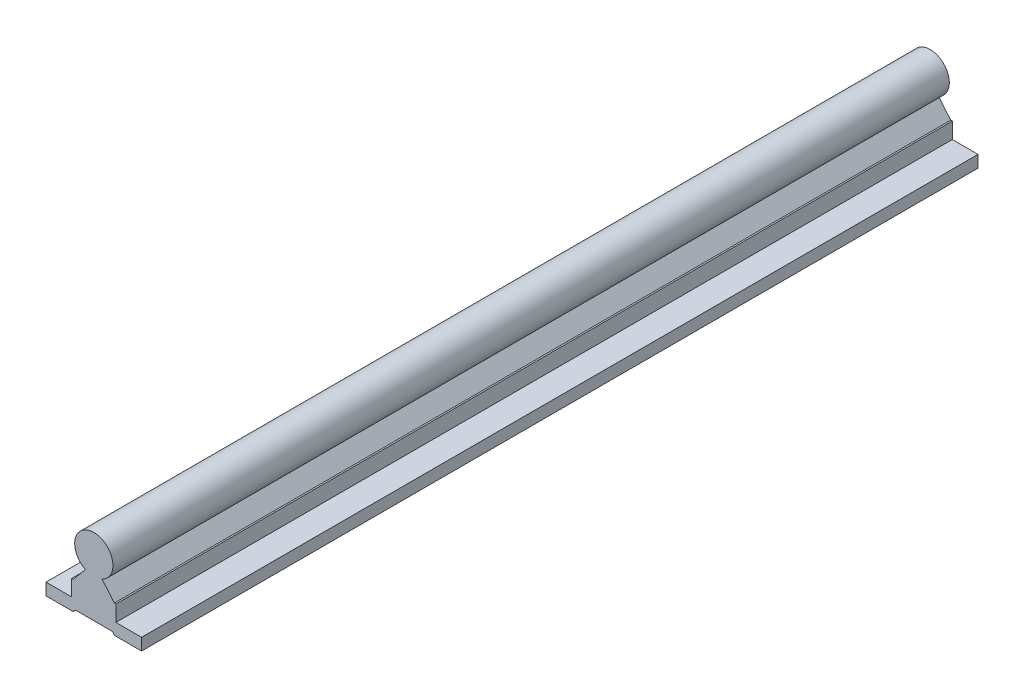
ISO-10303-21;
HEADER;
FILE_DESCRIPTION(('STEP AP214'),'2;1');
FILE_NAME('part.step','',(''),(''),'','','');
FILE_SCHEMA(('AUTOMOTIVE_DESIGN { 1 0 10303 214 1 1 1 1 }'));
ENDSEC;
DATA;
#1=APPLICATION_CONTEXT('core data for automotive mechanical design processes');
#2=APPLICATION_PROTOCOL_DEFINITION('international standard','automotive_design',2000,#1);
#3=PRODUCT_CONTEXT('',#1,'mechanical');
#4=PRODUCT('Part','Part','',(#3));
#5=PRODUCT_RELATED_PRODUCT_CATEGORY('part','',(#4));
#6=PRODUCT_DEFINITION_FORMATION('','',#4);
#7=PRODUCT_DEFINITION_CONTEXT('part definition',#1,'design');
#8=PRODUCT_DEFINITION('design','',#6,#7);
#9=PRODUCT_DEFINITION_SHAPE('','',#8);
#10=(LENGTH_UNIT() NAMED_UNIT(*) SI_UNIT(.MILLI.,.METRE.));
#11=(NAMED_UNIT(*) PLANE_ANGLE_UNIT() SI_UNIT($,.RADIAN.));
#12=(NAMED_UNIT(*) SI_UNIT($,.STERADIAN.) SOLID_ANGLE_UNIT());
#13=UNCERTAINTY_MEASURE_WITH_UNIT(LENGTH_MEASURE(1.E-05),#10,'distance_accuracy_value','');
#14=(GEOMETRIC_REPRESENTATION_CONTEXT(3) GLOBAL_UNCERTAINTY_ASSIGNED_CONTEXT((#13)) GLOBAL_UNIT_ASSIGNED_CONTEXT((#10,
#11,#12)) REPRESENTATION_CONTEXT('',''));
#15=CARTESIAN_POINT('',(0.,0.,0.));
#16=DIRECTION('',(0.,0.,1.));
#17=DIRECTION('',(1.,0.,0.));
#18=AXIS2_PLACEMENT_3D('',#15,#16,#17);
#19=CARTESIAN_POINT('',(0.,25.,350.));
#20=DIRECTION('',(0.,0.,-1.));
#21=DIRECTION('',(-1.,0.,0.));
#22=AXIS2_PLACEMENT_3D('',#19,#20,#21);
#23=CYLINDRICAL_SURFACE('',#22,8.);
#24=CARTESIAN_POINT('',(0.,25.,0.));
#25=DIRECTION('',(0.,0.,1.));
#26=DIRECTION('',(1.,0.,0.));
#27=AXIS2_PLACEMENT_3D('',#24,#25,#26);
#28=CIRCLE('',#27,8.);
#29=CARTESIAN_POINT('',(3.48711915483254,17.8,0.));
#30=VERTEX_POINT('',#29);
#31=CARTESIAN_POINT('',(-3.48711915483254,17.8,0.));
#32=VERTEX_POINT('',#31);
#33=EDGE_CURVE('E176',#30,#32,#28,.T.);
#34=ORIENTED_EDGE('',*,*,#33,.T.);
#35=DIRECTION('',(0.,0.,-1.));
#36=VECTOR('',#35,1.);
#37=CARTESIAN_POINT('',(-3.48711915483254,17.8,350.));
#38=LINE('',#37,#36);
#39=CARTESIAN_POINT('',(-3.48711915483254,17.8,350.));
#40=VERTEX_POINT('',#39);
#41=EDGE_CURVE('E11',#40,#32,#38,.T.);
#42=ORIENTED_EDGE('',*,*,#41,.F.);
#43=CARTESIAN_POINT('',(0.,25.,350.));
#44=DIRECTION('',(0.,0.,1.));
#45=DIRECTION('',(1.,0.,0.));
#46=AXIS2_PLACEMENT_3D('',#43,#44,#45);
#47=CIRCLE('',#46,8.);
#48=CARTESIAN_POINT('',(3.48711915483254,17.8,350.));
#49=VERTEX_POINT('',#48);
#50=EDGE_CURVE('E206',#49,#40,#47,.T.);
#51=ORIENTED_EDGE('',*,*,#50,.F.);
#52=DIRECTION('',(0.,0.,-1.));
#53=VECTOR('',#52,1.);
#54=CARTESIAN_POINT('',(3.48711915483254,17.8,350.));
#55=LINE('',#54,#53);
#56=EDGE_CURVE('E172',#49,#30,#55,.T.);
#57=ORIENTED_EDGE('',*,*,#56,.T.);
#58=EDGE_LOOP('',(#34,#42,#51,#57));
#59=FACE_BOUND('',#58,.T.);
#60=ADVANCED_FACE('F32',(#59),#23,.T.);
#61=CARTESIAN_POINT('',(-3.48711915483254,17.8,350.));
#62=DIRECTION('',(0.766044443118977,-0.64278760968654,0.));
#63=DIRECTION('',(0.64278760968654,0.766044443118977,0.));
#64=AXIS2_PLACEMENT_3D('',#61,#62,#63);
#65=PLANE('',#64);
#66=DIRECTION('',(-0.64278760968654,-0.766044443118977,0.));
#67=VECTOR('',#66,1.);
#68=CARTESIAN_POINT('',(-3.48711915483254,17.8,0.));
#69=LINE('',#68,#67);
#70=CARTESIAN_POINT('',(-8.60562690501396,11.7,0.));
#71=VERTEX_POINT('',#70);
#72=EDGE_CURVE('E179',#32,#71,#69,.T.);
#73=ORIENTED_EDGE('',*,*,#72,.T.);
#74=DIRECTION('',(0.,0.,-1.));
#75=VECTOR('',#74,1.);
#76=CARTESIAN_POINT('',(-8.60562690501396,11.7,350.));
#77=LINE('',#76,#75);
#78=CARTESIAN_POINT('',(-8.60562690501396,11.7,350.));
#79=VERTEX_POINT('',#78);
#80=EDGE_CURVE('E40',#79,#71,#77,.T.);
#81=ORIENTED_EDGE('',*,*,#80,.F.);
#82=DIRECTION('',(-0.64278760968654,-0.766044443118977,0.));
#83=VECTOR('',#82,1.);
#84=CARTESIAN_POINT('',(-3.48711915483254,17.8,350.));
#85=LINE('',#84,#83);
#86=EDGE_CURVE('E115',#40,#79,#85,.T.);
#87=ORIENTED_EDGE('',*,*,#86,.F.);
#88=ORIENTED_EDGE('',*,*,#41,.T.);
#89=EDGE_LOOP('',(#73,#81,#87,#88));
#90=FACE_BOUND('',#89,.T.);
#91=ADVANCED_FACE('F304',(#90),#65,.F.);
#92=CARTESIAN_POINT('',(-8.60562690501396,11.7,350.));
#93=DIRECTION('',(0.,-1.,0.));
#94=DIRECTION('',(0.,0.,-1.));
#95=AXIS2_PLACEMENT_3D('',#92,#93,#94);
#96=PLANE('',#95);
#97=DIRECTION('',(-1.,0.,0.));
#98=VECTOR('',#97,1.);
#99=CARTESIAN_POINT('',(-8.60562690501396,11.7,0.));
#100=LINE('',#99,#98);
#101=CARTESIAN_POINT('',(-9.25,11.7,0.));
#102=VERTEX_POINT('',#101);
#103=EDGE_CURVE('E181',#71,#102,#100,.T.);
#104=ORIENTED_EDGE('',*,*,#103,.T.);
#105=DIRECTION('',(0.,0.,-1.));
#106=VECTOR('',#105,1.);
#107=CARTESIAN_POINT('',(-9.25,11.7,350.));
#108=LINE('',#107,#106);
#109=CARTESIAN_POINT('',(-9.25,11.7,350.));
#110=VERTEX_POINT('',#109);
#111=EDGE_CURVE('E237',#110,#102,#108,.T.);
#112=ORIENTED_EDGE('',*,*,#111,.F.);
#113=DIRECTION('',(-1.,0.,0.));
#114=VECTOR('',#113,1.);
#115=CARTESIAN_POINT('',(-8.60562690501396,11.7,350.));
#116=LINE('',#115,#114);
#117=EDGE_CURVE('E245',#79,#110,#116,.T.);
#118=ORIENTED_EDGE('',*,*,#117,.F.);
#119=ORIENTED_EDGE('',*,*,#80,.T.);
#120=EDGE_LOOP('',(#104,#112,#118,#119));
#121=FACE_BOUND('',#120,.T.);
#122=ADVANCED_FACE('F243',(#121),#96,.F.);
#123=CARTESIAN_POINT('',(-9.25,11.7,350.));
#124=DIRECTION('',(1.,0.,0.));
#125=DIRECTION('',(0.,0.,-1.));
#126=AXIS2_PLACEMENT_3D('',#123,#124,#125);
#127=PLANE('',#126);
#128=DIRECTION('',(0.,-1.,0.));
#129=VECTOR('',#128,1.);
#130=CARTESIAN_POINT('',(-9.25,11.7,0.));
#131=LINE('',#130,#129);
#132=CARTESIAN_POINT('',(-9.25,5.,0.));
#133=VERTEX_POINT('',#132);
#134=EDGE_CURVE('E183',#102,#133,#131,.T.);
#135=ORIENTED_EDGE('',*,*,#134,.T.);
#136=DIRECTION('',(0.,0.,-1.));
#137=VECTOR('',#136,1.);
#138=CARTESIAN_POINT('',(-9.25,5.,350.));
#139=LINE('',#138,#137);
#140=CARTESIAN_POINT('',(-9.25,5.,350.));
#141=VERTEX_POINT('',#140);
#142=EDGE_CURVE('E234',#141,#133,#139,.T.);
#143=ORIENTED_EDGE('',*,*,#142,.F.);
#144=DIRECTION('',(0.,-1.,0.));
#145=VECTOR('',#144,1.);
#146=CARTESIAN_POINT('',(-9.25,11.7,350.));
#147=LINE('',#146,#145);
#148=EDGE_CURVE('E263',#110,#141,#147,.T.);
#149=ORIENTED_EDGE('',*,*,#148,.F.);
#150=ORIENTED_EDGE('',*,*,#111,.T.);
#151=EDGE_LOOP('',(#135,#143,#149,#150));
#152=FACE_BOUND('',#151,.T.);
#153=ADVANCED_FACE('F254',(#152),#127,.F.);
#154=CARTESIAN_POINT('',(-9.25,5.,350.));
#155=DIRECTION('',(0.,-1.,0.));
#156=DIRECTION('',(1.,0.,0.));
#157=AXIS2_PLACEMENT_3D('',#154,#155,#156);
#158=PLANE('',#157);
#159=DIRECTION('',(-1.,0.,0.));
#160=VECTOR('',#159,1.);
#161=CARTESIAN_POINT('',(-9.25,5.,0.));
#162=LINE('',#161,#160);
#163=CARTESIAN_POINT('',(-20.,5.,0.));
#164=VERTEX_POINT('',#163);
#165=EDGE_CURVE('E185',#133,#164,#162,.T.);
#166=ORIENTED_EDGE('',*,*,#165,.T.);
#167=DIRECTION('',(0.,0.,-1.));
#168=VECTOR('',#167,1.);
#169=CARTESIAN_POINT('',(-20.,5.,350.));
#170=LINE('',#169,#168);
#171=CARTESIAN_POINT('',(-20.,5.,350.));
#172=VERTEX_POINT('',#171);
#173=EDGE_CURVE('E231',#172,#164,#170,.T.);
#174=ORIENTED_EDGE('',*,*,#173,.F.);
#175=DIRECTION('',(-1.,0.,0.));
#176=VECTOR('',#175,1.);
#177=CARTESIAN_POINT('',(-9.25,5.,350.));
#178=LINE('',#177,#176);
#179=EDGE_CURVE('E260',#141,#172,#178,.T.);
#180=ORIENTED_EDGE('',*,*,#179,.F.);
#181=ORIENTED_EDGE('',*,*,#142,.T.);
#182=EDGE_LOOP('',(#166,#174,#180,#181));
#183=FACE_BOUND('',#182,.T.);
#184=ADVANCED_FACE('F258',(#183),#158,.F.);
#185=CARTESIAN_POINT('',(-20.,5.,350.));
#186=DIRECTION('',(1.,0.,0.));
#187=DIRECTION('',(0.,1.,0.));
#188=AXIS2_PLACEMENT_3D('',#185,#186,#187);
#189=PLANE('',#188);
#190=DIRECTION('',(0.,-1.,0.));
#191=VECTOR('',#190,1.);
#192=CARTESIAN_POINT('',(-20.,5.,0.));
#193=LINE('',#192,#191);
#194=CARTESIAN_POINT('',(-20.,0.,0.));
#195=VERTEX_POINT('',#194);
#196=EDGE_CURVE('E187',#164,#195,#193,.T.);
#197=ORIENTED_EDGE('',*,*,#196,.T.);
#198=DIRECTION('',(0.,0.,-1.));
#199=VECTOR('',#198,1.);
#200=CARTESIAN_POINT('',(-20.,0.,350.));
#201=LINE('',#200,#199);
#202=CARTESIAN_POINT('',(-20.,0.,350.));
#203=VERTEX_POINT('',#202);
#204=EDGE_CURVE('E228',#203,#195,#201,.T.);
#205=ORIENTED_EDGE('',*,*,#204,.F.);
#206=DIRECTION('',(0.,-1.,0.));
#207=VECTOR('',#206,1.);
#208=CARTESIAN_POINT('',(-20.,5.,350.));
#209=LINE('',#208,#207);
#210=EDGE_CURVE('E262',#172,#203,#209,.T.);
#211=ORIENTED_EDGE('',*,*,#210,.F.);
#212=ORIENTED_EDGE('',*,*,#173,.T.);
#213=EDGE_LOOP('',(#197,#205,#211,#212));
#214=FACE_BOUND('',#213,.T.);
#215=ADVANCED_FACE('F317',(#214),#189,.F.);
#216=CARTESIAN_POINT('',(-20.,0.,350.));
#217=DIRECTION('',(0.,1.,0.));
#218=DIRECTION('',(-1.,0.,0.));
#219=AXIS2_PLACEMENT_3D('',#216,#217,#218);
#220=PLANE('',#219);
#221=DIRECTION('',(1.,0.,0.));
#222=VECTOR('',#221,1.);
#223=CARTESIAN_POINT('',(-20.,0.,0.));
#224=LINE('',#223,#222);
#225=CARTESIAN_POINT('',(-8.60562690501397,0.,0.));
#226=VERTEX_POINT('',#225);
#227=EDGE_CURVE('E189',#195,#226,#224,.T.);
#228=ORIENTED_EDGE('',*,*,#227,.T.);
#229=DIRECTION('',(0.,0.,-1.));
#230=VECTOR('',#229,1.);
#231=CARTESIAN_POINT('',(-8.60562690501397,0.,350.));
#232=LINE('',#231,#230);
#233=CARTESIAN_POINT('',(-8.60562690501397,0.,350.));
#234=VERTEX_POINT('',#233);
#235=EDGE_CURVE('E225',#234,#226,#232,.T.);
#236=ORIENTED_EDGE('',*,*,#235,.F.);
#237=DIRECTION('',(1.,0.,0.));
#238=VECTOR('',#237,1.);
#239=CARTESIAN_POINT('',(-20.,0.,350.));
#240=LINE('',#239,#238);
#241=EDGE_CURVE('E265',#203,#234,#240,.T.);
#242=ORIENTED_EDGE('',*,*,#241,.F.);
#243=ORIENTED_EDGE('',*,*,#204,.T.);
#244=EDGE_LOOP('',(#228,#236,#242,#243));
#245=FACE_BOUND('',#244,.T.);
#246=ADVANCED_FACE('F320',(#245),#220,.F.);
#247=CARTESIAN_POINT('',(-8.60562690501397,0.,350.));
#248=DIRECTION('',(-0.766044443118977,0.642787609686541,0.));
#249=DIRECTION('',(-0.642787609686541,-0.766044443118977,0.));
#250=AXIS2_PLACEMENT_3D('',#247,#248,#249);
#251=PLANE('',#250);
#252=DIRECTION('',(0.642787609686541,0.766044443118977,0.));
#253=VECTOR('',#252,1.);
#254=CARTESIAN_POINT('',(-8.60562690501397,0.,0.));
#255=LINE('',#254,#253);
#256=CARTESIAN_POINT('',(-7.76652727383668,1.00000000000001,0.));
#257=VERTEX_POINT('',#256);
#258=EDGE_CURVE('E191',#226,#257,#255,.T.);
#259=ORIENTED_EDGE('',*,*,#258,.T.);
#260=DIRECTION('',(0.,0.,-1.));
#261=VECTOR('',#260,1.);
#262=CARTESIAN_POINT('',(-7.76652727383668,1.00000000000001,350.));
#263=LINE('',#262,#261);
#264=CARTESIAN_POINT('',(-7.76652727383668,1.00000000000001,350.));
#265=VERTEX_POINT('',#264);
#266=EDGE_CURVE('E222',#265,#257,#263,.T.);
#267=ORIENTED_EDGE('',*,*,#266,.F.);
#268=DIRECTION('',(0.642787609686541,0.766044443118977,0.));
#269=VECTOR('',#268,1.);
#270=CARTESIAN_POINT('',(-8.60562690501397,0.,350.));
#271=LINE('',#270,#269);
#272=EDGE_CURVE('E271',#234,#265,#271,.T.);
#273=ORIENTED_EDGE('',*,*,#272,.F.);
#274=ORIENTED_EDGE('',*,*,#235,.T.);
#275=EDGE_LOOP('',(#259,#267,#273,#274));
#276=FACE_BOUND('',#275,.T.);
#277=ADVANCED_FACE('F324',(#276),#251,.F.);
#278=CARTESIAN_POINT('',(-7.76652727383668,1.00000000000001,350.));
#279=DIRECTION('',(0.,1.,0.));
#280=DIRECTION('',(0.,0.,1.));
#281=AXIS2_PLACEMENT_3D('',#278,#279,#280);
#282=PLANE('',#281);
#283=DIRECTION('',(1.,0.,0.));
#284=VECTOR('',#283,1.);
#285=CARTESIAN_POINT('',(-7.76652727383668,1.00000000000001,0.));
#286=LINE('',#285,#284);
#287=CARTESIAN_POINT('',(7.76652727383668,1.00000000000001,0.));
#288=VERTEX_POINT('',#287);
#289=EDGE_CURVE('E193',#257,#288,#286,.T.);
#290=ORIENTED_EDGE('',*,*,#289,.T.);
#291=DIRECTION('',(0.,0.,-1.));
#292=VECTOR('',#291,1.);
#293=CARTESIAN_POINT('',(7.76652727383668,1.00000000000001,350.));
#294=LINE('',#293,#292);
#295=CARTESIAN_POINT('',(7.76652727383668,1.00000000000001,350.));
#296=VERTEX_POINT('',#295);
#297=EDGE_CURVE('E219',#296,#288,#294,.T.);
#298=ORIENTED_EDGE('',*,*,#297,.F.);
#299=DIRECTION('',(1.,0.,0.));
#300=VECTOR('',#299,1.);
#301=CARTESIAN_POINT('',(-7.76652727383668,1.00000000000001,350.));
#302=LINE('',#301,#300);
#303=EDGE_CURVE('E273',#265,#296,#302,.T.);
#304=ORIENTED_EDGE('',*,*,#303,.F.);
#305=ORIENTED_EDGE('',*,*,#266,.T.);
#306=EDGE_LOOP('',(#290,#298,#304,#305));
#307=FACE_BOUND('',#306,.T.);
#308=ADVANCED_FACE('F328',(#307),#282,.F.);
#309=CARTESIAN_POINT('',(8.60562690501397,0.,350.));
#310=DIRECTION('',(0.766044443118977,0.642787609686541,0.));
#311=DIRECTION('',(-0.642787609686541,0.766044443118977,0.));
#312=AXIS2_PLACEMENT_3D('',#309,#310,#311);
#313=PLANE('',#312);
#314=DIRECTION('',(0.642787609686541,-0.766044443118977,0.));
#315=VECTOR('',#314,1.);
#316=CARTESIAN_POINT('',(8.60562690501397,0.,0.));
#317=LINE('',#316,#315);
#318=CARTESIAN_POINT('',(8.60562690501397,0.,0.));
#319=VERTEX_POINT('',#318);
#320=EDGE_CURVE('E195',#288,#319,#317,.T.);
#321=ORIENTED_EDGE('',*,*,#320,.T.);
#322=DIRECTION('',(0.,0.,-1.));
#323=VECTOR('',#322,1.);
#324=CARTESIAN_POINT('',(8.60562690501397,0.,350.));
#325=LINE('',#324,#323);
#326=CARTESIAN_POINT('',(8.60562690501397,0.,350.));
#327=VERTEX_POINT('',#326);
#328=EDGE_CURVE('E216',#327,#319,#325,.T.);
#329=ORIENTED_EDGE('',*,*,#328,.F.);
#330=DIRECTION('',(0.642787609686541,-0.766044443118977,0.));
#331=VECTOR('',#330,1.);
#332=CARTESIAN_POINT('',(8.60562690501397,0.,350.));
#333=LINE('',#332,#331);
#334=EDGE_CURVE('E275',#296,#327,#333,.T.);
#335=ORIENTED_EDGE('',*,*,#334,.F.);
#336=ORIENTED_EDGE('',*,*,#297,.T.);
#337=EDGE_LOOP('',(#321,#329,#335,#336));
#338=FACE_BOUND('',#337,.T.);
#339=ADVANCED_FACE('F332',(#338),#313,.F.);
#340=CARTESIAN_POINT('',(20.,0.,350.));
#341=DIRECTION('',(0.,1.,0.));
#342=DIRECTION('',(-1.,0.,0.));
#343=AXIS2_PLACEMENT_3D('',#340,#341,#342);
#344=PLANE('',#343);
#345=DIRECTION('',(1.,0.,0.));
#346=VECTOR('',#345,1.);
#347=CARTESIAN_POINT('',(20.,0.,0.));
#348=LINE('',#347,#346);
#349=CARTESIAN_POINT('',(20.,0.,0.));
#350=VERTEX_POINT('',#349);
#351=EDGE_CURVE('E197',#319,#350,#348,.T.);
#352=ORIENTED_EDGE('',*,*,#351,.T.);
#353=DIRECTION('',(0.,0.,-1.));
#354=VECTOR('',#353,1.);
#355=CARTESIAN_POINT('',(20.,0.,350.));
#356=LINE('',#355,#354);
#357=CARTESIAN_POINT('',(20.,0.,350.));
#358=VERTEX_POINT('',#357);
#359=EDGE_CURVE('E213',#358,#350,#356,.T.);
#360=ORIENTED_EDGE('',*,*,#359,.F.);
#361=DIRECTION('',(1.,0.,0.));
#362=VECTOR('',#361,1.);
#363=CARTESIAN_POINT('',(20.,0.,350.));
#364=LINE('',#363,#362);
#365=EDGE_CURVE('E277',#327,#358,#364,.T.);
#366=ORIENTED_EDGE('',*,*,#365,.F.);
#367=ORIENTED_EDGE('',*,*,#328,.T.);
#368=EDGE_LOOP('',(#352,#360,#366,#367));
#369=FACE_BOUND('',#368,.T.);
#370=ADVANCED_FACE('F336',(#369),#344,.F.);
#371=CARTESIAN_POINT('',(20.,5.,350.));
#372=DIRECTION('',(-1.,0.,0.));
#373=DIRECTION('',(0.,-1.,0.));
#374=AXIS2_PLACEMENT_3D('',#371,#372,#373);
#375=PLANE('',#374);
#376=DIRECTION('',(0.,1.,0.));
#377=VECTOR('',#376,1.);
#378=CARTESIAN_POINT('',(20.,5.,0.));
#379=LINE('',#378,#377);
#380=CARTESIAN_POINT('',(20.,5.,0.));
#381=VERTEX_POINT('',#380);
#382=EDGE_CURVE('E199',#350,#381,#379,.T.);
#383=ORIENTED_EDGE('',*,*,#382,.T.);
#384=DIRECTION('',(0.,0.,-1.));
#385=VECTOR('',#384,1.);
#386=CARTESIAN_POINT('',(20.,5.,350.));
#387=LINE('',#386,#385);
#388=CARTESIAN_POINT('',(20.,5.,350.));
#389=VERTEX_POINT('',#388);
#390=EDGE_CURVE('E210',#389,#381,#387,.T.);
#391=ORIENTED_EDGE('',*,*,#390,.F.);
#392=DIRECTION('',(0.,1.,0.));
#393=VECTOR('',#392,1.);
#394=CARTESIAN_POINT('',(20.,5.,350.));
#395=LINE('',#394,#393);
#396=EDGE_CURVE('E279',#358,#389,#395,.T.);
#397=ORIENTED_EDGE('',*,*,#396,.F.);
#398=ORIENTED_EDGE('',*,*,#359,.T.);
#399=EDGE_LOOP('',(#383,#391,#397,#398));
#400=FACE_BOUND('',#399,.T.);
#401=ADVANCED_FACE('F285',(#400),#375,.F.);
#402=CARTESIAN_POINT('',(9.25,5.,350.));
#403=DIRECTION('',(0.,-1.,0.));
#404=DIRECTION('',(1.,0.,0.));
#405=AXIS2_PLACEMENT_3D('',#402,#403,#404);
#406=PLANE('',#405);
#407=DIRECTION('',(-1.,0.,0.));
#408=VECTOR('',#407,1.);
#409=CARTESIAN_POINT('',(9.25,5.,0.));
#410=LINE('',#409,#408);
#411=CARTESIAN_POINT('',(9.25,5.,0.));
#412=VERTEX_POINT('',#411);
#413=EDGE_CURVE('E201',#381,#412,#410,.T.);
#414=ORIENTED_EDGE('',*,*,#413,.T.);
#415=DIRECTION('',(0.,0.,-1.));
#416=VECTOR('',#415,1.);
#417=CARTESIAN_POINT('',(9.25,5.,350.));
#418=LINE('',#417,#416);
#419=CARTESIAN_POINT('',(9.25,5.,350.));
#420=VERTEX_POINT('',#419);
#421=EDGE_CURVE('E167',#420,#412,#418,.T.);
#422=ORIENTED_EDGE('',*,*,#421,.F.);
#423=DIRECTION('',(-1.,0.,0.));
#424=VECTOR('',#423,1.);
#425=CARTESIAN_POINT('',(9.25,5.,350.));
#426=LINE('',#425,#424);
#427=EDGE_CURVE('E158',#389,#420,#426,.T.);
#428=ORIENTED_EDGE('',*,*,#427,.F.);
#429=ORIENTED_EDGE('',*,*,#390,.T.);
#430=EDGE_LOOP('',(#414,#422,#428,#429));
#431=FACE_BOUND('',#430,.T.);
#432=ADVANCED_FACE('F289',(#431),#406,.F.);
#433=CARTESIAN_POINT('',(9.25,11.7,350.));
#434=DIRECTION('',(-1.,0.,0.));
#435=DIRECTION('',(0.,0.,1.));
#436=AXIS2_PLACEMENT_3D('',#433,#434,#435);
#437=PLANE('',#436);
#438=DIRECTION('',(0.,1.,0.));
#439=VECTOR('',#438,1.);
#440=CARTESIAN_POINT('',(9.25,11.7,0.));
#441=LINE('',#440,#439);
#442=CARTESIAN_POINT('',(9.25,11.7,0.));
#443=VERTEX_POINT('',#442);
#444=EDGE_CURVE('E166',#412,#443,#441,.T.);
#445=ORIENTED_EDGE('',*,*,#444,.T.);
#446=DIRECTION('',(0.,0.,-1.));
#447=VECTOR('',#446,1.);
#448=CARTESIAN_POINT('',(9.25,11.7,350.));
#449=LINE('',#448,#447);
#450=CARTESIAN_POINT('',(9.25,11.7,350.));
#451=VERTEX_POINT('',#450);
#452=EDGE_CURVE('E163',#451,#443,#449,.T.);
#453=ORIENTED_EDGE('',*,*,#452,.F.);
#454=DIRECTION('',(0.,1.,0.));
#455=VECTOR('',#454,1.);
#456=CARTESIAN_POINT('',(9.25,11.7,350.));
#457=LINE('',#456,#455);
#458=EDGE_CURVE('E152',#420,#451,#457,.T.);
#459=ORIENTED_EDGE('',*,*,#458,.F.);
#460=ORIENTED_EDGE('',*,*,#421,.T.);
#461=EDGE_LOOP('',(#445,#453,#459,#460));
#462=FACE_BOUND('',#461,.T.);
#463=ADVANCED_FACE('F164',(#462),#437,.F.);
#464=CARTESIAN_POINT('',(8.60562690501396,11.7,350.));
#465=DIRECTION('',(0.,-1.,0.));
#466=DIRECTION('',(0.,0.,-1.));
#467=AXIS2_PLACEMENT_3D('',#464,#465,#466);
#468=PLANE('',#467);
#469=DIRECTION('',(-1.,0.,0.));
#470=VECTOR('',#469,1.);
#471=CARTESIAN_POINT('',(8.60562690501396,11.7,0.));
#472=LINE('',#471,#470);
#473=CARTESIAN_POINT('',(8.60562690501396,11.7,0.));
#474=VERTEX_POINT('',#473);
#475=EDGE_CURVE('E101',#443,#474,#472,.T.);
#476=ORIENTED_EDGE('',*,*,#475,.T.);
#477=DIRECTION('',(0.,0.,-1.));
#478=VECTOR('',#477,1.);
#479=CARTESIAN_POINT('',(8.60562690501396,11.7,350.));
#480=LINE('',#479,#478);
#481=CARTESIAN_POINT('',(8.60562690501396,11.7,350.));
#482=VERTEX_POINT('',#481);
#483=EDGE_CURVE('E168',#482,#474,#480,.T.);
#484=ORIENTED_EDGE('',*,*,#483,.F.);
#485=DIRECTION('',(-1.,0.,0.));
#486=VECTOR('',#485,1.);
#487=CARTESIAN_POINT('',(8.60562690501396,11.7,350.));
#488=LINE('',#487,#486);
#489=EDGE_CURVE('E156',#451,#482,#488,.T.);
#490=ORIENTED_EDGE('',*,*,#489,.F.);
#491=ORIENTED_EDGE('',*,*,#452,.T.);
#492=EDGE_LOOP('',(#476,#484,#490,#491));
#493=FACE_BOUND('',#492,.T.);
#494=ADVANCED_FACE('F170',(#493),#468,.F.);
#495=CARTESIAN_POINT('',(3.48711915483254,17.8,350.));
#496=DIRECTION('',(-0.766044443118977,-0.64278760968654,0.));
#497=DIRECTION('',(0.64278760968654,-0.766044443118977,0.));
#498=AXIS2_PLACEMENT_3D('',#495,#496,#497);
#499=PLANE('',#498);
#500=DIRECTION('',(-0.64278760968654,0.766044443118977,0.));
#501=VECTOR('',#500,1.);
#502=CARTESIAN_POINT('',(3.48711915483254,17.8,0.));
#503=LINE('',#502,#501);
#504=EDGE_CURVE('E107',#474,#30,#503,.T.);
#505=ORIENTED_EDGE('',*,*,#504,.T.);
#506=ORIENTED_EDGE('',*,*,#56,.F.);
#507=DIRECTION('',(-0.64278760968654,0.766044443118977,0.));
#508=VECTOR('',#507,1.);
#509=CARTESIAN_POINT('',(3.48711915483254,17.8,350.));
#510=LINE('',#509,#508);
#511=EDGE_CURVE('E48',#482,#49,#510,.T.);
#512=ORIENTED_EDGE('',*,*,#511,.F.);
#513=ORIENTED_EDGE('',*,*,#483,.T.);
#514=EDGE_LOOP('',(#505,#506,#512,#513));
#515=FACE_BOUND('',#514,.T.);
#516=ADVANCED_FACE('F293',(#515),#499,.F.);
#517=CARTESIAN_POINT('',(0.,25.,350.));
#518=DIRECTION('',(0.,0.,1.));
#519=DIRECTION('',(1.,0.,0.));
#520=AXIS2_PLACEMENT_3D('',#517,#518,#519);
#521=PLANE('',#520);
#522=ORIENTED_EDGE('',*,*,#50,.T.);
#523=ORIENTED_EDGE('',*,*,#86,.T.);
#524=ORIENTED_EDGE('',*,*,#117,.T.);
#525=ORIENTED_EDGE('',*,*,#148,.T.);
#526=ORIENTED_EDGE('',*,*,#179,.T.);
#527=ORIENTED_EDGE('',*,*,#210,.T.);
#528=ORIENTED_EDGE('',*,*,#241,.T.);
#529=ORIENTED_EDGE('',*,*,#272,.T.);
#530=ORIENTED_EDGE('',*,*,#303,.T.);
#531=ORIENTED_EDGE('',*,*,#334,.T.);
#532=ORIENTED_EDGE('',*,*,#365,.T.);
#533=ORIENTED_EDGE('',*,*,#396,.T.);
#534=ORIENTED_EDGE('',*,*,#427,.T.);
#535=ORIENTED_EDGE('',*,*,#458,.T.);
#536=ORIENTED_EDGE('',*,*,#489,.T.);
#537=ORIENTED_EDGE('',*,*,#511,.T.);
#538=EDGE_LOOP('',(#522,#523,#524,#525,#526,#527,#528,#529,#530,#531,#532,#533,#534,#535,#536,#537));
#539=FACE_BOUND('',#538,.T.);
#540=ADVANCED_FACE('F154',(#539),#521,.T.);
#541=CARTESIAN_POINT('',(0.,25.,0.));
#542=DIRECTION('',(0.,0.,1.));
#543=DIRECTION('',(1.,0.,0.));
#544=AXIS2_PLACEMENT_3D('',#541,#542,#543);
#545=PLANE('',#544);
#546=ORIENTED_EDGE('',*,*,#33,.F.);
#547=ORIENTED_EDGE('',*,*,#504,.F.);
#548=ORIENTED_EDGE('',*,*,#475,.F.);
#549=ORIENTED_EDGE('',*,*,#444,.F.);
#550=ORIENTED_EDGE('',*,*,#413,.F.);
#551=ORIENTED_EDGE('',*,*,#382,.F.);
#552=ORIENTED_EDGE('',*,*,#351,.F.);
#553=ORIENTED_EDGE('',*,*,#320,.F.);
#554=ORIENTED_EDGE('',*,*,#289,.F.);
#555=ORIENTED_EDGE('',*,*,#258,.F.);
#556=ORIENTED_EDGE('',*,*,#227,.F.);
#557=ORIENTED_EDGE('',*,*,#196,.F.);
#558=ORIENTED_EDGE('',*,*,#165,.F.);
#559=ORIENTED_EDGE('',*,*,#134,.F.);
#560=ORIENTED_EDGE('',*,*,#103,.F.);
#561=ORIENTED_EDGE('',*,*,#72,.F.);
#562=EDGE_LOOP('',(#546,#547,#548,#549,#550,#551,#552,#553,#554,#555,#556,#557,#558,#559,#560,#561));
#563=FACE_BOUND('',#562,.T.);
#564=ADVANCED_FACE('F249',(#563),#545,.F.);
#565=CLOSED_SHELL('',(#60,#91,#122,#153,#184,#215,#246,#277,#308,#339,#370,#401,#432,#463,#494,
#516,#540,#564));
#566=MANIFOLD_SOLID_BREP('B2',#565);
#567=ADVANCED_BREP_SHAPE_REPRESENTATION('',(#18,#566),#14);
#568=SHAPE_DEFINITION_REPRESENTATION(#9,#567);
ENDSEC;
END-ISO-10303-21;
